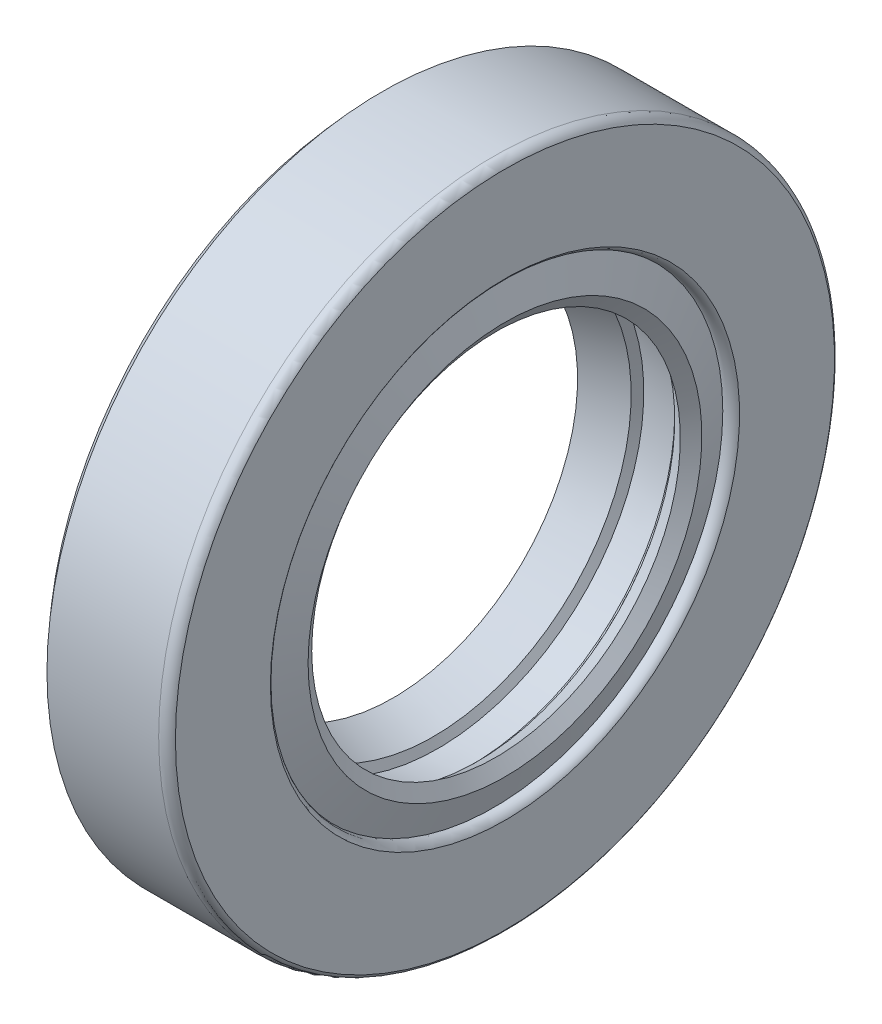
ISO-10303-21;
HEADER;
FILE_DESCRIPTION(('STEP AP214'),'2;1');
FILE_NAME('part.step','',(''),(''),'','','');
FILE_SCHEMA(('AUTOMOTIVE_DESIGN { 1 0 10303 214 1 1 1 1 }'));
ENDSEC;
DATA;
#1=APPLICATION_CONTEXT('core data for automotive mechanical design processes');
#2=APPLICATION_PROTOCOL_DEFINITION('international standard','automotive_design',2000,#1);
#3=PRODUCT_CONTEXT('',#1,'mechanical');
#4=PRODUCT('Part','Part','',(#3));
#5=PRODUCT_RELATED_PRODUCT_CATEGORY('part','',(#4));
#6=PRODUCT_DEFINITION_FORMATION('','',#4);
#7=PRODUCT_DEFINITION_CONTEXT('part definition',#1,'design');
#8=PRODUCT_DEFINITION('design','',#6,#7);
#9=PRODUCT_DEFINITION_SHAPE('','',#8);
#10=(LENGTH_UNIT() NAMED_UNIT(*) SI_UNIT(.MILLI.,.METRE.));
#11=(NAMED_UNIT(*) PLANE_ANGLE_UNIT() SI_UNIT($,.RADIAN.));
#12=(NAMED_UNIT(*) SI_UNIT($,.STERADIAN.) SOLID_ANGLE_UNIT());
#13=UNCERTAINTY_MEASURE_WITH_UNIT(LENGTH_MEASURE(1.E-05),#10,'distance_accuracy_value','');
#14=(GEOMETRIC_REPRESENTATION_CONTEXT(3) GLOBAL_UNCERTAINTY_ASSIGNED_CONTEXT((#13)) GLOBAL_UNIT_ASSIGNED_CONTEXT((#10,
#11,#12)) REPRESENTATION_CONTEXT('',''));
#15=CARTESIAN_POINT('',(0.,0.,0.));
#16=DIRECTION('',(0.,0.,1.));
#17=DIRECTION('',(1.,0.,0.));
#18=AXIS2_PLACEMENT_3D('',#15,#16,#17);
#19=CARTESIAN_POINT('',(0.,0.,0.));
#20=DIRECTION('',(-1.,0.,0.));
#21=DIRECTION('',(0.,0.,1.));
#22=AXIS2_PLACEMENT_3D('',#19,#20,#21);
#23=CYLINDRICAL_SURFACE('',#22,20.);
#24=CARTESIAN_POINT('',(7.33333333333333,0.,0.));
#25=DIRECTION('',(-1.,0.,0.));
#26=DIRECTION('',(0.,0.,1.));
#27=AXIS2_PLACEMENT_3D('',#24,#25,#26);
#28=CIRCLE('',#27,20.);
#29=CARTESIAN_POINT('',(7.33333333333333,0.,20.));
#30=VERTEX_POINT('',#29);
#31=EDGE_CURVE('E10',#30,#30,#28,.T.);
#32=ORIENTED_EDGE('',*,*,#31,.T.);
#33=EDGE_LOOP('',(#32));
#34=FACE_BOUND('',#33,.T.);
#35=CARTESIAN_POINT('',(0.666666666666667,0.,0.));
#36=DIRECTION('',(-1.,0.,0.));
#37=DIRECTION('',(0.,0.,1.));
#38=AXIS2_PLACEMENT_3D('',#35,#36,#37);
#39=CIRCLE('',#38,20.);
#40=CARTESIAN_POINT('',(0.666666666666667,0.,20.));
#41=VERTEX_POINT('',#40);
#42=EDGE_CURVE('E82',#41,#41,#39,.T.);
#43=ORIENTED_EDGE('',*,*,#42,.F.);
#44=EDGE_LOOP('',(#43));
#45=FACE_BOUND('',#44,.T.);
#46=ADVANCED_FACE('F15',(#34,#45),#23,.T.);
#47=CARTESIAN_POINT('',(7.41946005043015,0.,0.));
#48=DIRECTION('',(-1.,0.,0.));
#49=DIRECTION('',(0.,0.,1.));
#50=AXIS2_PLACEMENT_3D('',#47,#48,#49);
#51=TOROIDAL_SURFACE('',#50,19.3389201008603,0.666666666666667);
#52=ORIENTED_EDGE('',*,*,#31,.F.);
#53=EDGE_LOOP('',(#52));
#54=FACE_BOUND('',#53,.T.);
#55=CARTESIAN_POINT('',(8.,0.,0.));
#56=DIRECTION('',(-1.,0.,0.));
#57=DIRECTION('',(0.,0.,1.));
#58=AXIS2_PLACEMENT_3D('',#55,#56,#57);
#59=CIRCLE('',#58,19.6666666666666);
#60=CARTESIAN_POINT('',(8.,0.,19.6666666666666));
#61=VERTEX_POINT('',#60);
#62=EDGE_CURVE('E21',#61,#61,#59,.T.);
#63=ORIENTED_EDGE('',*,*,#62,.T.);
#64=EDGE_LOOP('',(#63));
#65=FACE_BOUND('',#64,.T.);
#66=ADVANCED_FACE('F90',(#54,#65),#51,.T.);
#67=CARTESIAN_POINT('',(8.,19.6666666666666,0.));
#68=DIRECTION('',(1.,0.,0.));
#69=DIRECTION('',(0.,0.,-1.));
#70=AXIS2_PLACEMENT_3D('',#67,#68,#69);
#71=PLANE('',#70);
#72=CARTESIAN_POINT('',(8.,0.,0.));
#73=DIRECTION('',(-1.,0.,0.));
#74=DIRECTION('',(0.,0.,1.));
#75=AXIS2_PLACEMENT_3D('',#72,#73,#74);
#76=CIRCLE('',#75,14.);
#77=CARTESIAN_POINT('',(8.,0.,14.));
#78=VERTEX_POINT('',#77);
#79=EDGE_CURVE('E25',#78,#78,#76,.T.);
#80=ORIENTED_EDGE('',*,*,#79,.T.);
#81=EDGE_LOOP('',(#80));
#82=FACE_BOUND('',#81,.T.);
#83=ORIENTED_EDGE('',*,*,#62,.F.);
#84=EDGE_LOOP('',(#83));
#85=FACE_BOUND('',#84,.T.);
#86=ADVANCED_FACE('F95',(#82,#85),#71,.T.);
#87=CARTESIAN_POINT('',(7.41946005043015,0.,0.));
#88=DIRECTION('',(-1.,0.,0.));
#89=DIRECTION('',(0.,0.,1.));
#90=AXIS2_PLACEMENT_3D('',#87,#88,#89);
#91=TOROIDAL_SURFACE('',#90,14.3277465658064,0.666666666666667);
#92=ORIENTED_EDGE('',*,*,#79,.F.);
#93=EDGE_LOOP('',(#92));
#94=FACE_BOUND('',#93,.T.);
#95=CARTESIAN_POINT('',(7.33333333333333,0.,0.));
#96=DIRECTION('',(-1.,0.,0.));
#97=DIRECTION('',(0.,0.,1.));
#98=AXIS2_PLACEMENT_3D('',#95,#96,#97);
#99=CIRCLE('',#98,13.6666666666667);
#100=CARTESIAN_POINT('',(7.33333333333333,0.,13.6666666666667));
#101=VERTEX_POINT('',#100);
#102=EDGE_CURVE('E29',#101,#101,#99,.T.);
#103=ORIENTED_EDGE('',*,*,#102,.T.);
#104=EDGE_LOOP('',(#103));
#105=FACE_BOUND('',#104,.T.);
#106=ADVANCED_FACE('F100',(#94,#105),#91,.T.);
#107=CARTESIAN_POINT('',(8.,0.,0.));
#108=DIRECTION('',(-1.,0.,0.));
#109=DIRECTION('',(0.,0.,1.));
#110=AXIS2_PLACEMENT_3D('',#107,#108,#109);
#111=CONICAL_SURFACE('',#110,11.75,1.23605948947808);
#112=ORIENTED_EDGE('',*,*,#102,.F.);
#113=EDGE_LOOP('',(#112));
#114=FACE_BOUND('',#113,.T.);
#115=CARTESIAN_POINT('',(8.,0.,0.));
#116=DIRECTION('',(-1.,0.,0.));
#117=DIRECTION('',(0.,0.,1.));
#118=AXIS2_PLACEMENT_3D('',#115,#116,#117);
#119=CIRCLE('',#118,11.75);
#120=CARTESIAN_POINT('',(8.,0.,11.75));
#121=VERTEX_POINT('',#120);
#122=EDGE_CURVE('E34',#121,#121,#119,.T.);
#123=ORIENTED_EDGE('',*,*,#122,.T.);
#124=EDGE_LOOP('',(#123));
#125=FACE_BOUND('',#124,.T.);
#126=ADVANCED_FACE('F106',(#114,#125),#111,.T.);
#127=CARTESIAN_POINT('',(7.46666666666667,0.,0.));
#128=DIRECTION('',(1.,0.,0.));
#129=DIRECTION('',(0.,0.,-1.));
#130=AXIS2_PLACEMENT_3D('',#127,#128,#129);
#131=CONICAL_SURFACE('',#130,11.,0.952652100859709);
#132=ORIENTED_EDGE('',*,*,#122,.F.);
#133=EDGE_LOOP('',(#132));
#134=FACE_BOUND('',#133,.T.);
#135=CARTESIAN_POINT('',(7.46666666666667,0.,0.));
#136=DIRECTION('',(-1.,0.,0.));
#137=DIRECTION('',(0.,0.,1.));
#138=AXIS2_PLACEMENT_3D('',#135,#136,#137);
#139=CIRCLE('',#138,11.);
#140=CARTESIAN_POINT('',(7.46666666666667,0.,11.));
#141=VERTEX_POINT('',#140);
#142=EDGE_CURVE('E37',#141,#141,#139,.T.);
#143=ORIENTED_EDGE('',*,*,#142,.T.);
#144=EDGE_LOOP('',(#143));
#145=FACE_BOUND('',#144,.T.);
#146=ADVANCED_FACE('F110',(#134,#145),#131,.F.);
#147=CARTESIAN_POINT('',(6.33333333333333,0.,0.));
#148=DIRECTION('',(-1.,0.,0.));
#149=DIRECTION('',(0.,0.,1.));
#150=AXIS2_PLACEMENT_3D('',#147,#148,#149);
#151=CONICAL_SURFACE('',#150,11.8,0.614662951922166);
#152=ORIENTED_EDGE('',*,*,#142,.F.);
#153=EDGE_LOOP('',(#152));
#154=FACE_BOUND('',#153,.T.);
#155=CARTESIAN_POINT('',(6.33333333333333,0.,0.));
#156=DIRECTION('',(-1.,0.,0.));
#157=DIRECTION('',(0.,0.,1.));
#158=AXIS2_PLACEMENT_3D('',#155,#156,#157);
#159=CIRCLE('',#158,11.8);
#160=CARTESIAN_POINT('',(6.33333333333333,0.,11.8));
#161=VERTEX_POINT('',#160);
#162=EDGE_CURVE('E40',#161,#161,#159,.T.);
#163=ORIENTED_EDGE('',*,*,#162,.T.);
#164=EDGE_LOOP('',(#163));
#165=FACE_BOUND('',#164,.T.);
#166=ADVANCED_FACE('F114',(#154,#165),#151,.F.);
#167=CARTESIAN_POINT('',(5.72570811482257,0.,0.));
#168=DIRECTION('',(-1.,0.,0.));
#169=DIRECTION('',(0.,0.,1.));
#170=AXIS2_PLACEMENT_3D('',#167,#168,#169);
#171=TOROIDAL_SURFACE('',#170,11.5257081148226,0.666666666666667);
#172=CARTESIAN_POINT('',(6.,0.,0.));
#173=DIRECTION('',(-1.,0.,0.));
#174=DIRECTION('',(0.,0.,1.));
#175=AXIS2_PLACEMENT_3D('',#172,#173,#174);
#176=CIRCLE('',#175,12.1333333333333);
#177=CARTESIAN_POINT('',(6.,0.,12.1333333333333));
#178=VERTEX_POINT('',#177);
#179=EDGE_CURVE('E43',#178,#178,#176,.T.);
#180=ORIENTED_EDGE('',*,*,#179,.T.);
#181=EDGE_LOOP('',(#180));
#182=FACE_BOUND('',#181,.T.);
#183=ORIENTED_EDGE('',*,*,#162,.F.);
#184=EDGE_LOOP('',(#183));
#185=FACE_BOUND('',#184,.T.);
#186=ADVANCED_FACE('F118',(#182,#185),#171,.F.);
#187=CARTESIAN_POINT('',(4.,0.,0.));
#188=DIRECTION('',(-1.,0.,0.));
#189=DIRECTION('',(0.,0.,1.));
#190=AXIS2_PLACEMENT_3D('',#187,#188,#189);
#191=CONICAL_SURFACE('',#190,12.2857142857143,0.0760435592791177);
#192=ORIENTED_EDGE('',*,*,#179,.F.);
#193=EDGE_LOOP('',(#192));
#194=FACE_BOUND('',#193,.T.);
#195=CARTESIAN_POINT('',(4.,0.,0.));
#196=DIRECTION('',(-1.,0.,0.));
#197=DIRECTION('',(0.,0.,1.));
#198=AXIS2_PLACEMENT_3D('',#195,#196,#197);
#199=CIRCLE('',#198,12.2857142857143);
#200=CARTESIAN_POINT('',(4.,0.,12.2857142857143));
#201=VERTEX_POINT('',#200);
#202=EDGE_CURVE('E46',#201,#201,#199,.T.);
#203=ORIENTED_EDGE('',*,*,#202,.T.);
#204=EDGE_LOOP('',(#203));
#205=FACE_BOUND('',#204,.T.);
#206=ADVANCED_FACE('F122',(#194,#205),#191,.F.);
#207=CARTESIAN_POINT('',(4.,0.,0.));
#208=DIRECTION('',(1.,0.,0.));
#209=DIRECTION('',(0.,0.,-1.));
#210=AXIS2_PLACEMENT_3D('',#207,#208,#209);
#211=CONICAL_SURFACE('',#210,12.2857142857143,1.0687061277729);
#212=CARTESIAN_POINT('',(3.73333333333334,0.,0.));
#213=DIRECTION('',(-1.,0.,0.));
#214=DIRECTION('',(0.,0.,1.));
#215=AXIS2_PLACEMENT_3D('',#212,#213,#214);
#216=CIRCLE('',#215,11.8);
#217=CARTESIAN_POINT('',(3.73333333333334,0.,11.8));
#218=VERTEX_POINT('',#217);
#219=EDGE_CURVE('E49',#218,#218,#216,.T.);
#220=ORIENTED_EDGE('',*,*,#219,.T.);
#221=EDGE_LOOP('',(#220));
#222=FACE_BOUND('',#221,.T.);
#223=ORIENTED_EDGE('',*,*,#202,.F.);
#224=EDGE_LOOP('',(#223));
#225=FACE_BOUND('',#224,.T.);
#226=ADVANCED_FACE('F126',(#222,#225),#211,.F.);
#227=CARTESIAN_POINT('',(3.73333333333334,0.,0.));
#228=DIRECTION('',(1.,0.,0.));
#229=DIRECTION('',(0.,0.,-1.));
#230=AXIS2_PLACEMENT_3D('',#227,#228,#229);
#231=CONICAL_SURFACE('',#230,11.8,0.321750554396642);
#232=CARTESIAN_POINT('',(1.33333333333333,0.,0.));
#233=DIRECTION('',(-1.,0.,0.));
#234=DIRECTION('',(0.,0.,1.));
#235=AXIS2_PLACEMENT_3D('',#232,#233,#234);
#236=CIRCLE('',#235,11.);
#237=CARTESIAN_POINT('',(1.33333333333333,0.,11.));
#238=VERTEX_POINT('',#237);
#239=EDGE_CURVE('E52',#238,#238,#236,.T.);
#240=ORIENTED_EDGE('',*,*,#239,.T.);
#241=EDGE_LOOP('',(#240));
#242=FACE_BOUND('',#241,.T.);
#243=ORIENTED_EDGE('',*,*,#219,.F.);
#244=EDGE_LOOP('',(#243));
#245=FACE_BOUND('',#244,.T.);
#246=ADVANCED_FACE('F130',(#242,#245),#231,.F.);
#247=CARTESIAN_POINT('',(1.33333333333333,0.,0.));
#248=DIRECTION('',(-1.,0.,0.));
#249=DIRECTION('',(0.,0.,1.));
#250=AXIS2_PLACEMENT_3D('',#247,#248,#249);
#251=CONICAL_SURFACE('',#250,11.,1.01419700878467);
#252=CARTESIAN_POINT('',(0.533333333333334,0.,0.));
#253=DIRECTION('',(-1.,0.,0.));
#254=DIRECTION('',(0.,0.,1.));
#255=AXIS2_PLACEMENT_3D('',#252,#253,#254);
#256=CIRCLE('',#255,12.2857142857143);
#257=CARTESIAN_POINT('',(0.533333333333334,0.,12.2857142857143));
#258=VERTEX_POINT('',#257);
#259=EDGE_CURVE('E55',#258,#258,#256,.T.);
#260=ORIENTED_EDGE('',*,*,#259,.T.);
#261=EDGE_LOOP('',(#260));
#262=FACE_BOUND('',#261,.T.);
#263=ORIENTED_EDGE('',*,*,#239,.F.);
#264=EDGE_LOOP('',(#263));
#265=FACE_BOUND('',#264,.T.);
#266=ADVANCED_FACE('F134',(#262,#265),#251,.F.);
#267=CARTESIAN_POINT('',(0.533333333333333,12.2857142857143,0.));
#268=DIRECTION('',(-1.,0.,0.));
#269=DIRECTION('',(0.,0.,1.));
#270=AXIS2_PLACEMENT_3D('',#267,#268,#269);
#271=PLANE('',#270);
#272=CARTESIAN_POINT('',(0.533333333333334,0.,0.));
#273=DIRECTION('',(-1.,0.,0.));
#274=DIRECTION('',(0.,0.,1.));
#275=AXIS2_PLACEMENT_3D('',#272,#273,#274);
#276=CIRCLE('',#275,14.2045941546018);
#277=CARTESIAN_POINT('',(0.533333333333334,0.,14.2045941546018));
#278=VERTEX_POINT('',#277);
#279=EDGE_CURVE('E58',#278,#278,#276,.T.);
#280=ORIENTED_EDGE('',*,*,#279,.T.);
#281=EDGE_LOOP('',(#280));
#282=FACE_BOUND('',#281,.T.);
#283=ORIENTED_EDGE('',*,*,#259,.F.);
#284=EDGE_LOOP('',(#283));
#285=FACE_BOUND('',#284,.T.);
#286=ADVANCED_FACE('F138',(#282,#285),#271,.T.);
#287=CARTESIAN_POINT('',(0.,0.,0.));
#288=DIRECTION('',(-1.,0.,0.));
#289=DIRECTION('',(0.,0.,1.));
#290=AXIS2_PLACEMENT_3D('',#287,#288,#289);
#291=CYLINDRICAL_SURFACE('',#290,14.2045941546018);
#292=CARTESIAN_POINT('',(1.53766894977733,0.,0.));
#293=DIRECTION('',(-1.,0.,0.));
#294=DIRECTION('',(0.,0.,1.));
#295=AXIS2_PLACEMENT_3D('',#292,#293,#294);
#296=CIRCLE('',#295,14.2045941546018);
#297=CARTESIAN_POINT('',(1.53766894977733,0.,14.2045941546018));
#298=VERTEX_POINT('',#297);
#299=EDGE_CURVE('E61',#298,#298,#296,.T.);
#300=ORIENTED_EDGE('',*,*,#299,.T.);
#301=EDGE_LOOP('',(#300));
#302=FACE_BOUND('',#301,.T.);
#303=ORIENTED_EDGE('',*,*,#279,.F.);
#304=EDGE_LOOP('',(#303));
#305=FACE_BOUND('',#304,.T.);
#306=ADVANCED_FACE('F142',(#302,#305),#291,.T.);
#307=CARTESIAN_POINT('',(2.,0.,0.));
#308=DIRECTION('',(-1.,0.,0.));
#309=DIRECTION('',(0.,0.,1.));
#310=AXIS2_PLACEMENT_3D('',#307,#308,#309);
#311=TOROIDAL_SURFACE('',#310,13.25,1.06066017177982);
#312=ORIENTED_EDGE('',*,*,#299,.F.);
#313=EDGE_LOOP('',(#312));
#314=FACE_BOUND('',#313,.T.);
#315=CARTESIAN_POINT('',(3.02454262623781,0.,0.));
#316=DIRECTION('',(-1.,0.,0.));
#317=DIRECTION('',(0.,0.,1.));
#318=AXIS2_PLACEMENT_3D('',#315,#316,#317);
#319=CIRCLE('',#318,13.5244310605994);
#320=CARTESIAN_POINT('',(3.02454262623781,0.,13.5244310605994));
#321=VERTEX_POINT('',#320);
#322=EDGE_CURVE('E64',#321,#321,#319,.T.);
#323=ORIENTED_EDGE('',*,*,#322,.T.);
#324=EDGE_LOOP('',(#323));
#325=FACE_BOUND('',#324,.T.);
#326=ADVANCED_FACE('F146',(#314,#325),#311,.T.);
#327=CARTESIAN_POINT('',(4.8,0.,0.));
#328=DIRECTION('',(1.,0.,0.));
#329=DIRECTION('',(0.,0.,-1.));
#330=AXIS2_PLACEMENT_3D('',#327,#328,#329);
#331=CONICAL_SURFACE('',#330,14.,0.261713502401205);
#332=ORIENTED_EDGE('',*,*,#322,.F.);
#333=EDGE_LOOP('',(#332));
#334=FACE_BOUND('',#333,.T.);
#335=CARTESIAN_POINT('',(4.8,0.,0.));
#336=DIRECTION('',(-1.,0.,0.));
#337=DIRECTION('',(0.,0.,1.));
#338=AXIS2_PLACEMENT_3D('',#335,#336,#337);
#339=CIRCLE('',#338,14.);
#340=CARTESIAN_POINT('',(4.8,0.,14.));
#341=VERTEX_POINT('',#340);
#342=EDGE_CURVE('E67',#341,#341,#339,.T.);
#343=ORIENTED_EDGE('',*,*,#342,.T.);
#344=EDGE_LOOP('',(#343));
#345=FACE_BOUND('',#344,.T.);
#346=ADVANCED_FACE('F150',(#334,#345),#331,.T.);
#347=CARTESIAN_POINT('',(4.8,17.4166666666667,0.));
#348=DIRECTION('',(1.,0.,0.));
#349=DIRECTION('',(0.,0.,-1.));
#350=AXIS2_PLACEMENT_3D('',#347,#348,#349);
#351=PLANE('',#350);
#352=ORIENTED_EDGE('',*,*,#342,.F.);
#353=EDGE_LOOP('',(#352));
#354=FACE_BOUND('',#353,.T.);
#355=CARTESIAN_POINT('',(4.8,0.,0.));
#356=DIRECTION('',(-1.,0.,0.));
#357=DIRECTION('',(0.,0.,1.));
#358=AXIS2_PLACEMENT_3D('',#355,#356,#357);
#359=CIRCLE('',#358,17.4166666666667);
#360=CARTESIAN_POINT('',(4.8,0.,17.4166666666667));
#361=VERTEX_POINT('',#360);
#362=EDGE_CURVE('E70',#361,#361,#359,.T.);
#363=ORIENTED_EDGE('',*,*,#362,.T.);
#364=EDGE_LOOP('',(#363));
#365=FACE_BOUND('',#364,.T.);
#366=ADVANCED_FACE('F154',(#354,#365),#351,.F.);
#367=CARTESIAN_POINT('',(4.19237478148924,0.,0.));
#368=DIRECTION('',(-1.,0.,0.));
#369=DIRECTION('',(0.,0.,1.));
#370=AXIS2_PLACEMENT_3D('',#367,#368,#369);
#371=TOROIDAL_SURFACE('',#370,17.1423747814892,0.666666666666667);
#372=CARTESIAN_POINT('',(4.46666666666667,0.,0.));
#373=DIRECTION('',(-1.,0.,0.));
#374=DIRECTION('',(0.,0.,1.));
#375=AXIS2_PLACEMENT_3D('',#372,#373,#374);
#376=CIRCLE('',#375,17.75);
#377=CARTESIAN_POINT('',(4.46666666666667,0.,17.75));
#378=VERTEX_POINT('',#377);
#379=EDGE_CURVE('E73',#378,#378,#376,.T.);
#380=ORIENTED_EDGE('',*,*,#379,.T.);
#381=EDGE_LOOP('',(#380));
#382=FACE_BOUND('',#381,.T.);
#383=ORIENTED_EDGE('',*,*,#362,.F.);
#384=EDGE_LOOP('',(#383));
#385=FACE_BOUND('',#384,.T.);
#386=ADVANCED_FACE('F158',(#382,#385),#371,.F.);
#387=CARTESIAN_POINT('',(0.,0.,0.));
#388=DIRECTION('',(-1.,0.,0.));
#389=DIRECTION('',(0.,0.,1.));
#390=AXIS2_PLACEMENT_3D('',#387,#388,#389);
#391=CONICAL_SURFACE('',#390,18.2,0.100407477624554);
#392=ORIENTED_EDGE('',*,*,#379,.F.);
#393=EDGE_LOOP('',(#392));
#394=FACE_BOUND('',#393,.T.);
#395=CARTESIAN_POINT('',(0.,0.,0.));
#396=DIRECTION('',(-1.,0.,0.));
#397=DIRECTION('',(0.,0.,1.));
#398=AXIS2_PLACEMENT_3D('',#395,#396,#397);
#399=CIRCLE('',#398,18.2);
#400=CARTESIAN_POINT('',(0.,0.,18.2));
#401=VERTEX_POINT('',#400);
#402=EDGE_CURVE('E76',#401,#401,#399,.T.);
#403=ORIENTED_EDGE('',*,*,#402,.T.);
#404=EDGE_LOOP('',(#403));
#405=FACE_BOUND('',#404,.T.);
#406=ADVANCED_FACE('F162',(#394,#405),#391,.F.);
#407=CARTESIAN_POINT('',(0.,18.2,0.));
#408=DIRECTION('',(-1.,0.,0.));
#409=DIRECTION('',(0.,0.,1.));
#410=AXIS2_PLACEMENT_3D('',#407,#408,#409);
#411=PLANE('',#410);
#412=CARTESIAN_POINT('',(0.,0.,0.));
#413=DIRECTION('',(-1.,0.,0.));
#414=DIRECTION('',(0.,0.,1.));
#415=AXIS2_PLACEMENT_3D('',#412,#413,#414);
#416=CIRCLE('',#415,19.25);
#417=CARTESIAN_POINT('',(0.,0.,19.25));
#418=VERTEX_POINT('',#417);
#419=EDGE_CURVE('E79',#418,#418,#416,.T.);
#420=ORIENTED_EDGE('',*,*,#419,.T.);
#421=EDGE_LOOP('',(#420));
#422=FACE_BOUND('',#421,.T.);
#423=ORIENTED_EDGE('',*,*,#402,.F.);
#424=EDGE_LOOP('',(#423));
#425=FACE_BOUND('',#424,.T.);
#426=ADVANCED_FACE('F166',(#422,#425),#411,.T.);
#427=CARTESIAN_POINT('',(0.,0.,0.));
#428=DIRECTION('',(1.,0.,0.));
#429=DIRECTION('',(0.,0.,-1.));
#430=AXIS2_PLACEMENT_3D('',#427,#428,#429);
#431=CONICAL_SURFACE('',#430,19.25,0.844153986113171);
#432=ORIENTED_EDGE('',*,*,#42,.T.);
#433=EDGE_LOOP('',(#432));
#434=FACE_BOUND('',#433,.T.);
#435=ORIENTED_EDGE('',*,*,#419,.F.);
#436=EDGE_LOOP('',(#435));
#437=FACE_BOUND('',#436,.T.);
#438=ADVANCED_FACE('F86',(#434,#437),#431,.T.);
#439=CLOSED_SHELL('',(#46,#66,#86,#106,#126,#146,#166,#186,#206,#226,#246,#266,#286,#306,#326,
#346,#366,#386,#406,#426,#438));
#440=MANIFOLD_SOLID_BREP('B1',#439);
#441=ADVANCED_BREP_SHAPE_REPRESENTATION('',(#18,#440),#14);
#442=SHAPE_DEFINITION_REPRESENTATION(#9,#441);
ENDSEC;
END-ISO-10303-21;
